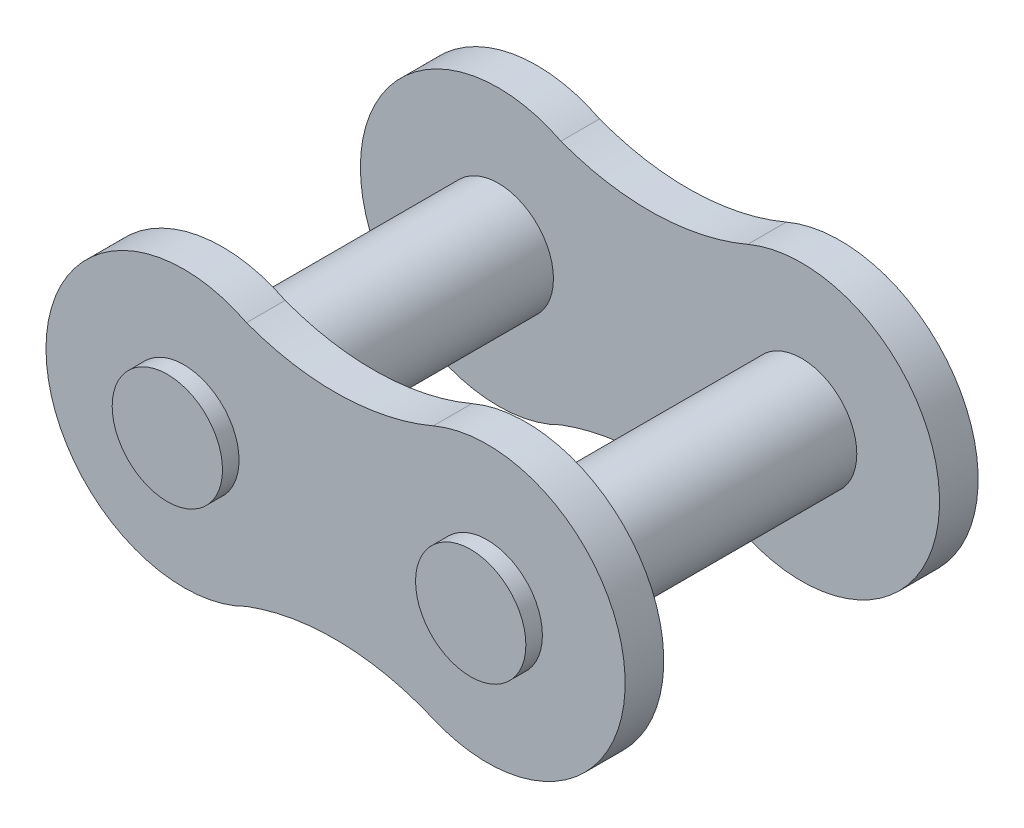
ISO-10303-21;
HEADER;
FILE_DESCRIPTION(('STEP AP214'),'2;1');
FILE_NAME('part.step','',(''),(''),'','','');
FILE_SCHEMA(('AUTOMOTIVE_DESIGN { 1 0 10303 214 1 1 1 1 }'));
ENDSEC;
DATA;
#1=APPLICATION_CONTEXT('core data for automotive mechanical design processes');
#2=APPLICATION_PROTOCOL_DEFINITION('international standard','automotive_design',2000,#1);
#3=PRODUCT_CONTEXT('',#1,'mechanical');
#4=PRODUCT('Part','Part','',(#3));
#5=PRODUCT_RELATED_PRODUCT_CATEGORY('part','',(#4));
#6=PRODUCT_DEFINITION_FORMATION('','',#4);
#7=PRODUCT_DEFINITION_CONTEXT('part definition',#1,'design');
#8=PRODUCT_DEFINITION('design','',#6,#7);
#9=PRODUCT_DEFINITION_SHAPE('','',#8);
#10=(LENGTH_UNIT() NAMED_UNIT(*) SI_UNIT(.MILLI.,.METRE.));
#11=(NAMED_UNIT(*) PLANE_ANGLE_UNIT() SI_UNIT($,.RADIAN.));
#12=(NAMED_UNIT(*) SI_UNIT($,.STERADIAN.) SOLID_ANGLE_UNIT());
#13=UNCERTAINTY_MEASURE_WITH_UNIT(LENGTH_MEASURE(1.E-05),#10,'distance_accuracy_value','');
#14=(GEOMETRIC_REPRESENTATION_CONTEXT(3) GLOBAL_UNCERTAINTY_ASSIGNED_CONTEXT((#13)) GLOBAL_UNIT_ASSIGNED_CONTEXT((#10,
#11,#12)) REPRESENTATION_CONTEXT('',''));
#15=CARTESIAN_POINT('',(0.,0.,0.));
#16=DIRECTION('',(0.,0.,1.));
#17=DIRECTION('',(1.,0.,0.));
#18=AXIS2_PLACEMENT_3D('',#15,#16,#17);
#19=CARTESIAN_POINT('',(2.75,0.,-6.));
#20=DIRECTION('',(0.,0.,1.));
#21=DIRECTION('',(1.,0.,0.));
#22=AXIS2_PLACEMENT_3D('',#19,#20,#21);
#23=CYLINDRICAL_SURFACE('',#22,1.);
#24=CARTESIAN_POINT('',(2.75,0.,0.));
#25=DIRECTION('',(0.,0.,1.));
#26=DIRECTION('',(1.,0.,0.));
#27=AXIS2_PLACEMENT_3D('',#24,#25,#26);
#28=CIRCLE('',#27,1.);
#29=CARTESIAN_POINT('',(3.75,0.,0.));
#30=VERTEX_POINT('',#29);
#31=EDGE_CURVE('E158',#30,#30,#28,.F.);
#32=ORIENTED_EDGE('',*,*,#31,.T.);
#33=EDGE_LOOP('',(#32));
#34=FACE_BOUND('',#33,.T.);
#35=CARTESIAN_POINT('',(2.75,0.,-5.));
#36=DIRECTION('',(0.,0.,-1.));
#37=DIRECTION('',(-1.,0.,0.));
#38=AXIS2_PLACEMENT_3D('',#35,#36,#37);
#39=CIRCLE('',#38,1.);
#40=CARTESIAN_POINT('',(1.75,0.,-5.));
#41=VERTEX_POINT('',#40);
#42=EDGE_CURVE('E11',#41,#41,#39,.T.);
#43=ORIENTED_EDGE('',*,*,#42,.F.);
#44=EDGE_LOOP('',(#43));
#45=FACE_BOUND('',#44,.T.);
#46=ADVANCED_FACE('F32',(#34,#45),#23,.T.);
#47=CARTESIAN_POINT('',(1.36834808013689,3.25198822837307,0.7));
#48=DIRECTION('',(0.,0.,1.));
#49=DIRECTION('',(1.,0.,0.));
#50=AXIS2_PLACEMENT_3D('',#47,#48,#49);
#51=PLANE('',#50);
#52=CARTESIAN_POINT('',(-2.75,0.,0.7));
#53=DIRECTION('',(0.,0.,1.));
#54=DIRECTION('',(1.,0.,0.));
#55=AXIS2_PLACEMENT_3D('',#52,#53,#54);
#56=CIRCLE('',#55,1.);
#57=CARTESIAN_POINT('',(-1.75,0.,0.7));
#58=VERTEX_POINT('',#57);
#59=EDGE_CURVE('E166',#58,#58,#56,.T.);
#60=ORIENTED_EDGE('',*,*,#59,.F.);
#61=EDGE_LOOP('',(#60));
#62=FACE_BOUND('',#61,.T.);
#63=CARTESIAN_POINT('',(-0.0133038397262195,6.50397645674614,0.7));
#64=DIRECTION('',(0.,0.,-1.));
#65=DIRECTION('',(1.,0.,0.));
#66=AXIS2_PLACEMENT_3D('',#63,#64,#65);
#67=CIRCLE('',#66,4.56665110646859);
#68=CARTESIAN_POINT('',(1.77241394187525,2.30094013371928,0.7));
#69=VERTEX_POINT('',#68);
#70=CARTESIAN_POINT('',(-1.61443216069154,2.22721478136445,0.7));
#71=VERTEX_POINT('',#70);
#72=EDGE_CURVE('E170',#69,#71,#67,.T.);
#73=ORIENTED_EDGE('',*,*,#72,.T.);
#74=CARTESIAN_POINT('',(-2.75,0.,0.7));
#75=DIRECTION('',(0.,0.,1.));
#76=DIRECTION('',(1.,0.,0.));
#77=AXIS2_PLACEMENT_3D('',#74,#75,#76);
#78=CIRCLE('',#77,2.5);
#79=CARTESIAN_POINT('',(-1.61443216069154,-2.22721478136445,0.7));
#80=VERTEX_POINT('',#79);
#81=EDGE_CURVE('E81',#71,#80,#78,.T.);
#82=ORIENTED_EDGE('',*,*,#81,.T.);
#83=CARTESIAN_POINT('',(-0.0133038397262195,-6.50397645674614,0.7));
#84=DIRECTION('',(0.,0.,-1.));
#85=DIRECTION('',(-1.,0.,0.));
#86=AXIS2_PLACEMENT_3D('',#83,#84,#85);
#87=CIRCLE('',#86,4.56665110646859);
#88=CARTESIAN_POINT('',(1.77241394187525,-2.30094013371928,0.7));
#89=VERTEX_POINT('',#88);
#90=EDGE_CURVE('E173',#80,#89,#87,.T.);
#91=ORIENTED_EDGE('',*,*,#90,.T.);
#92=CARTESIAN_POINT('',(2.75,0.,0.7));
#93=DIRECTION('',(0.,0.,1.));
#94=DIRECTION('',(1.,0.,0.));
#95=AXIS2_PLACEMENT_3D('',#92,#93,#94);
#96=CIRCLE('',#95,2.5);
#97=EDGE_CURVE('E49',#89,#69,#96,.T.);
#98=ORIENTED_EDGE('',*,*,#97,.T.);
#99=EDGE_LOOP('',(#73,#82,#91,#98));
#100=FACE_BOUND('',#99,.T.);
#101=CARTESIAN_POINT('',(2.75,0.,0.7));
#102=DIRECTION('',(0.,0.,1.));
#103=DIRECTION('',(1.,0.,0.));
#104=AXIS2_PLACEMENT_3D('',#101,#102,#103);
#105=CIRCLE('',#104,1.);
#106=CARTESIAN_POINT('',(3.75,0.,0.7));
#107=VERTEX_POINT('',#106);
#108=EDGE_CURVE('E163',#107,#107,#105,.T.);
#109=ORIENTED_EDGE('',*,*,#108,.F.);
#110=EDGE_LOOP('',(#109));
#111=FACE_BOUND('',#110,.T.);
#112=ADVANCED_FACE('F196',(#62,#100,#111),#51,.T.);
#113=CARTESIAN_POINT('',(1.36834808013689,3.25198822837307,0.));
#114=DIRECTION('',(0.,0.,1.));
#115=DIRECTION('',(1.,0.,0.));
#116=AXIS2_PLACEMENT_3D('',#113,#114,#115);
#117=PLANE('',#116);
#118=CARTESIAN_POINT('',(-2.75,0.,0.));
#119=DIRECTION('',(0.,0.,1.));
#120=DIRECTION('',(1.,0.,0.));
#121=AXIS2_PLACEMENT_3D('',#118,#119,#120);
#122=CIRCLE('',#121,1.);
#123=CARTESIAN_POINT('',(-1.75,0.,0.));
#124=VERTEX_POINT('',#123);
#125=EDGE_CURVE('E396',#124,#124,#122,.F.);
#126=ORIENTED_EDGE('',*,*,#125,.F.);
#127=EDGE_LOOP('',(#126));
#128=FACE_BOUND('',#127,.T.);
#129=CARTESIAN_POINT('',(-0.0133038397262195,6.50397645674614,0.));
#130=DIRECTION('',(0.,0.,-1.));
#131=DIRECTION('',(1.,0.,0.));
#132=AXIS2_PLACEMENT_3D('',#129,#130,#131);
#133=CIRCLE('',#132,4.56665110646859);
#134=CARTESIAN_POINT('',(1.77241394187525,2.30094013371928,0.));
#135=VERTEX_POINT('',#134);
#136=CARTESIAN_POINT('',(-1.61443216069154,2.22721478136445,0.));
#137=VERTEX_POINT('',#136);
#138=EDGE_CURVE('E169',#135,#137,#133,.T.);
#139=ORIENTED_EDGE('',*,*,#138,.F.);
#140=CARTESIAN_POINT('',(2.75,0.,0.));
#141=DIRECTION('',(0.,0.,1.));
#142=DIRECTION('',(1.,0.,0.));
#143=AXIS2_PLACEMENT_3D('',#140,#141,#142);
#144=CIRCLE('',#143,2.5);
#145=CARTESIAN_POINT('',(1.77241394187525,-2.30094013371928,0.));
#146=VERTEX_POINT('',#145);
#147=EDGE_CURVE('E73',#146,#135,#144,.T.);
#148=ORIENTED_EDGE('',*,*,#147,.F.);
#149=CARTESIAN_POINT('',(-0.0133038397262195,-6.50397645674614,0.));
#150=DIRECTION('',(0.,0.,-1.));
#151=DIRECTION('',(-1.,0.,0.));
#152=AXIS2_PLACEMENT_3D('',#149,#150,#151);
#153=CIRCLE('',#152,4.56665110646859);
#154=CARTESIAN_POINT('',(-1.61443216069154,-2.22721478136445,0.));
#155=VERTEX_POINT('',#154);
#156=EDGE_CURVE('E67',#155,#146,#153,.T.);
#157=ORIENTED_EDGE('',*,*,#156,.F.);
#158=CARTESIAN_POINT('',(-2.75,0.,0.));
#159=DIRECTION('',(0.,0.,1.));
#160=DIRECTION('',(1.,0.,0.));
#161=AXIS2_PLACEMENT_3D('',#158,#159,#160);
#162=CIRCLE('',#161,2.5);
#163=EDGE_CURVE('E179',#137,#155,#162,.T.);
#164=ORIENTED_EDGE('',*,*,#163,.F.);
#165=EDGE_LOOP('',(#139,#148,#157,#164));
#166=FACE_BOUND('',#165,.T.);
#167=ORIENTED_EDGE('',*,*,#31,.F.);
#168=EDGE_LOOP('',(#167));
#169=FACE_BOUND('',#168,.T.);
#170=ADVANCED_FACE('F193',(#128,#166,#169),#117,.F.);
#171=CARTESIAN_POINT('',(-0.0133038397262195,6.50397645674614,0.7));
#172=DIRECTION('',(0.,0.,-1.));
#173=DIRECTION('',(-1.,0.,0.));
#174=AXIS2_PLACEMENT_3D('',#171,#172,#173);
#175=CYLINDRICAL_SURFACE('',#174,4.56665110646859);
#176=ORIENTED_EDGE('',*,*,#138,.T.);
#177=DIRECTION('',(0.,0.,-1.));
#178=VECTOR('',#177,1.);
#179=CARTESIAN_POINT('',(-1.61443216069154,2.22721478136445,0.7));
#180=LINE('',#179,#178);
#181=EDGE_CURVE('E41',#71,#137,#180,.T.);
#182=ORIENTED_EDGE('',*,*,#181,.F.);
#183=ORIENTED_EDGE('',*,*,#72,.F.);
#184=DIRECTION('',(0.,0.,-1.));
#185=VECTOR('',#184,1.);
#186=CARTESIAN_POINT('',(1.77241394187525,2.30094013371928,0.7));
#187=LINE('',#186,#185);
#188=EDGE_CURVE('E176',#69,#135,#187,.T.);
#189=ORIENTED_EDGE('',*,*,#188,.T.);
#190=EDGE_LOOP('',(#176,#182,#183,#189));
#191=FACE_BOUND('',#190,.T.);
#192=ADVANCED_FACE('F34',(#191),#175,.F.);
#193=CARTESIAN_POINT('',(-2.75,0.,0.7));
#194=DIRECTION('',(0.,0.,-1.));
#195=DIRECTION('',(-1.,0.,0.));
#196=AXIS2_PLACEMENT_3D('',#193,#194,#195);
#197=CYLINDRICAL_SURFACE('',#196,2.5);
#198=ORIENTED_EDGE('',*,*,#163,.T.);
#199=DIRECTION('',(0.,0.,-1.));
#200=VECTOR('',#199,1.);
#201=CARTESIAN_POINT('',(-1.61443216069154,-2.22721478136445,0.7));
#202=LINE('',#201,#200);
#203=EDGE_CURVE('E186',#80,#155,#202,.T.);
#204=ORIENTED_EDGE('',*,*,#203,.F.);
#205=ORIENTED_EDGE('',*,*,#81,.F.);
#206=ORIENTED_EDGE('',*,*,#181,.T.);
#207=EDGE_LOOP('',(#198,#204,#205,#206));
#208=FACE_BOUND('',#207,.T.);
#209=ADVANCED_FACE('F188',(#208),#197,.T.);
#210=CARTESIAN_POINT('',(-0.0133038397262195,-6.50397645674614,0.7));
#211=DIRECTION('',(0.,0.,-1.));
#212=DIRECTION('',(-1.,0.,0.));
#213=AXIS2_PLACEMENT_3D('',#210,#211,#212);
#214=CYLINDRICAL_SURFACE('',#213,4.56665110646859);
#215=ORIENTED_EDGE('',*,*,#156,.T.);
#216=DIRECTION('',(0.,0.,-1.));
#217=VECTOR('',#216,1.);
#218=CARTESIAN_POINT('',(1.77241394187525,-2.30094013371928,0.7));
#219=LINE('',#218,#217);
#220=EDGE_CURVE('E184',#89,#146,#219,.T.);
#221=ORIENTED_EDGE('',*,*,#220,.F.);
#222=ORIENTED_EDGE('',*,*,#90,.F.);
#223=ORIENTED_EDGE('',*,*,#203,.T.);
#224=EDGE_LOOP('',(#215,#221,#222,#223));
#225=FACE_BOUND('',#224,.T.);
#226=ADVANCED_FACE('F249',(#225),#214,.F.);
#227=CARTESIAN_POINT('',(2.75,0.,0.7));
#228=DIRECTION('',(0.,0.,-1.));
#229=DIRECTION('',(-1.,0.,0.));
#230=AXIS2_PLACEMENT_3D('',#227,#228,#229);
#231=CYLINDRICAL_SURFACE('',#230,2.5);
#232=ORIENTED_EDGE('',*,*,#147,.T.);
#233=ORIENTED_EDGE('',*,*,#188,.F.);
#234=ORIENTED_EDGE('',*,*,#97,.F.);
#235=ORIENTED_EDGE('',*,*,#220,.T.);
#236=EDGE_LOOP('',(#232,#233,#234,#235));
#237=FACE_BOUND('',#236,.T.);
#238=ADVANCED_FACE('F242',(#237),#231,.T.);
#239=ORIENTED_EDGE('',*,*,#108,.T.);
#240=EDGE_LOOP('',(#239));
#241=FACE_BOUND('',#240,.T.);
#242=CARTESIAN_POINT('',(2.75,0.,1.));
#243=DIRECTION('',(0.,0.,-1.));
#244=DIRECTION('',(-1.,0.,0.));
#245=AXIS2_PLACEMENT_3D('',#242,#243,#244);
#246=CIRCLE('',#245,1.);
#247=CARTESIAN_POINT('',(1.75,0.,1.));
#248=VERTEX_POINT('',#247);
#249=EDGE_CURVE('E119',#248,#248,#246,.T.);
#250=ORIENTED_EDGE('',*,*,#249,.T.);
#251=EDGE_LOOP('',(#250));
#252=FACE_BOUND('',#251,.T.);
#253=ADVANCED_FACE('F205',(#241,#252),#23,.T.);
#254=CARTESIAN_POINT('',(2.75,0.,1.));
#255=DIRECTION('',(0.,0.,-1.));
#256=DIRECTION('',(-1.,0.,0.));
#257=AXIS2_PLACEMENT_3D('',#254,#255,#256);
#258=PLANE('',#257);
#259=ORIENTED_EDGE('',*,*,#249,.F.);
#260=EDGE_LOOP('',(#259));
#261=FACE_BOUND('',#260,.T.);
#262=ADVANCED_FACE('F217',(#261),#258,.F.);
#263=CARTESIAN_POINT('',(1.36834808013689,3.25198822837307,-5.7));
#264=DIRECTION('',(0.,0.,-1.));
#265=DIRECTION('',(1.,0.,0.));
#266=AXIS2_PLACEMENT_3D('',#263,#264,#265);
#267=PLANE('',#266);
#268=CARTESIAN_POINT('',(-2.75,0.,-5.7));
#269=DIRECTION('',(0.,0.,-1.));
#270=DIRECTION('',(-1.,0.,0.));
#271=AXIS2_PLACEMENT_3D('',#268,#269,#270);
#272=CIRCLE('',#271,1.);
#273=CARTESIAN_POINT('',(-3.75,0.,-5.7));
#274=VERTEX_POINT('',#273);
#275=EDGE_CURVE('E391',#274,#274,#272,.F.);
#276=ORIENTED_EDGE('',*,*,#275,.T.);
#277=EDGE_LOOP('',(#276));
#278=FACE_BOUND('',#277,.T.);
#279=CARTESIAN_POINT('',(-0.0133038397262195,6.50397645674614,-5.7));
#280=DIRECTION('',(0.,0.,-1.));
#281=DIRECTION('',(1.,0.,0.));
#282=AXIS2_PLACEMENT_3D('',#279,#280,#281);
#283=CIRCLE('',#282,4.56665110646859);
#284=CARTESIAN_POINT('',(1.77241394187525,2.30094013371928,-5.7));
#285=VERTEX_POINT('',#284);
#286=CARTESIAN_POINT('',(-1.61443216069154,2.22721478136445,-5.7));
#287=VERTEX_POINT('',#286);
#288=EDGE_CURVE('E127',#285,#287,#283,.T.);
#289=ORIENTED_EDGE('',*,*,#288,.F.);
#290=CARTESIAN_POINT('',(2.75,0.,-5.7));
#291=DIRECTION('',(0.,0.,1.));
#292=DIRECTION('',(1.,0.,0.));
#293=AXIS2_PLACEMENT_3D('',#290,#291,#292);
#294=CIRCLE('',#293,2.5);
#295=CARTESIAN_POINT('',(1.77241394187525,-2.30094013371928,-5.7));
#296=VERTEX_POINT('',#295);
#297=EDGE_CURVE('E144',#296,#285,#294,.T.);
#298=ORIENTED_EDGE('',*,*,#297,.F.);
#299=CARTESIAN_POINT('',(-0.0133038397262195,-6.50397645674614,-5.7));
#300=DIRECTION('',(0.,0.,-1.));
#301=DIRECTION('',(-1.,0.,0.));
#302=AXIS2_PLACEMENT_3D('',#299,#300,#301);
#303=CIRCLE('',#302,4.56665110646859);
#304=CARTESIAN_POINT('',(-1.61443216069154,-2.22721478136445,-5.7));
#305=VERTEX_POINT('',#304);
#306=EDGE_CURVE('E129',#305,#296,#303,.T.);
#307=ORIENTED_EDGE('',*,*,#306,.F.);
#308=CARTESIAN_POINT('',(-2.75,0.,-5.7));
#309=DIRECTION('',(0.,0.,1.));
#310=DIRECTION('',(1.,0.,0.));
#311=AXIS2_PLACEMENT_3D('',#308,#309,#310);
#312=CIRCLE('',#311,2.5);
#313=EDGE_CURVE('E111',#287,#305,#312,.T.);
#314=ORIENTED_EDGE('',*,*,#313,.F.);
#315=EDGE_LOOP('',(#289,#298,#307,#314));
#316=FACE_BOUND('',#315,.T.);
#317=CARTESIAN_POINT('',(2.75,0.,-5.7));
#318=DIRECTION('',(0.,0.,1.));
#319=DIRECTION('',(1.,0.,0.));
#320=AXIS2_PLACEMENT_3D('',#317,#318,#319);
#321=CIRCLE('',#320,1.);
#322=CARTESIAN_POINT('',(3.75,0.,-5.7));
#323=VERTEX_POINT('',#322);
#324=EDGE_CURVE('E398',#323,#323,#321,.T.);
#325=ORIENTED_EDGE('',*,*,#324,.T.);
#326=EDGE_LOOP('',(#325));
#327=FACE_BOUND('',#326,.T.);
#328=ADVANCED_FACE('F124',(#278,#316,#327),#267,.T.);
#329=CARTESIAN_POINT('',(1.36834808013689,3.25198822837307,-5.));
#330=DIRECTION('',(0.,0.,-1.));
#331=DIRECTION('',(1.,0.,0.));
#332=AXIS2_PLACEMENT_3D('',#329,#330,#331);
#333=PLANE('',#332);
#334=CARTESIAN_POINT('',(-2.75,0.,-5.));
#335=DIRECTION('',(0.,0.,1.));
#336=DIRECTION('',(1.,0.,0.));
#337=AXIS2_PLACEMENT_3D('',#334,#335,#336);
#338=CIRCLE('',#337,1.);
#339=CARTESIAN_POINT('',(-1.75,0.,-5.));
#340=VERTEX_POINT('',#339);
#341=EDGE_CURVE('E140',#340,#340,#338,.T.);
#342=ORIENTED_EDGE('',*,*,#341,.F.);
#343=EDGE_LOOP('',(#342));
#344=FACE_BOUND('',#343,.T.);
#345=CARTESIAN_POINT('',(-0.0133038397262195,6.50397645674614,-5.));
#346=DIRECTION('',(0.,0.,-1.));
#347=DIRECTION('',(1.,0.,0.));
#348=AXIS2_PLACEMENT_3D('',#345,#346,#347);
#349=CIRCLE('',#348,4.56665110646859);
#350=CARTESIAN_POINT('',(1.77241394187525,2.30094013371928,-5.));
#351=VERTEX_POINT('',#350);
#352=CARTESIAN_POINT('',(-1.61443216069154,2.22721478136445,-5.));
#353=VERTEX_POINT('',#352);
#354=EDGE_CURVE('E146',#351,#353,#349,.T.);
#355=ORIENTED_EDGE('',*,*,#354,.T.);
#356=CARTESIAN_POINT('',(-2.75,0.,-5.));
#357=DIRECTION('',(0.,0.,1.));
#358=DIRECTION('',(1.,0.,0.));
#359=AXIS2_PLACEMENT_3D('',#356,#357,#358);
#360=CIRCLE('',#359,2.5);
#361=CARTESIAN_POINT('',(-1.61443216069154,-2.22721478136445,-5.));
#362=VERTEX_POINT('',#361);
#363=EDGE_CURVE('E114',#353,#362,#360,.T.);
#364=ORIENTED_EDGE('',*,*,#363,.T.);
#365=CARTESIAN_POINT('',(-0.0133038397262195,-6.50397645674614,-5.));
#366=DIRECTION('',(0.,0.,-1.));
#367=DIRECTION('',(-1.,0.,0.));
#368=AXIS2_PLACEMENT_3D('',#365,#366,#367);
#369=CIRCLE('',#368,4.56665110646859);
#370=CARTESIAN_POINT('',(1.77241394187525,-2.30094013371928,-5.));
#371=VERTEX_POINT('',#370);
#372=EDGE_CURVE('E137',#362,#371,#369,.T.);
#373=ORIENTED_EDGE('',*,*,#372,.T.);
#374=CARTESIAN_POINT('',(2.75,0.,-5.));
#375=DIRECTION('',(0.,0.,1.));
#376=DIRECTION('',(1.,0.,0.));
#377=AXIS2_PLACEMENT_3D('',#374,#375,#376);
#378=CIRCLE('',#377,2.5);
#379=EDGE_CURVE('E134',#371,#351,#378,.T.);
#380=ORIENTED_EDGE('',*,*,#379,.T.);
#381=EDGE_LOOP('',(#355,#364,#373,#380));
#382=FACE_BOUND('',#381,.T.);
#383=ORIENTED_EDGE('',*,*,#42,.T.);
#384=EDGE_LOOP('',(#383));
#385=FACE_BOUND('',#384,.T.);
#386=ADVANCED_FACE('F208',(#344,#382,#385),#333,.F.);
#387=CARTESIAN_POINT('',(-0.0133038397262195,6.50397645674614,-5.7));
#388=DIRECTION('',(0.,0.,1.));
#389=DIRECTION('',(-1.,0.,0.));
#390=AXIS2_PLACEMENT_3D('',#387,#388,#389);
#391=CYLINDRICAL_SURFACE('',#390,4.56665110646859);
#392=ORIENTED_EDGE('',*,*,#354,.F.);
#393=DIRECTION('',(0.,0.,1.));
#394=VECTOR('',#393,1.);
#395=CARTESIAN_POINT('',(1.77241394187525,2.30094013371928,-5.7));
#396=LINE('',#395,#394);
#397=EDGE_CURVE('E132',#285,#351,#396,.T.);
#398=ORIENTED_EDGE('',*,*,#397,.F.);
#399=ORIENTED_EDGE('',*,*,#288,.T.);
#400=DIRECTION('',(0.,0.,1.));
#401=VECTOR('',#400,1.);
#402=CARTESIAN_POINT('',(-1.61443216069154,2.22721478136445,-5.7));
#403=LINE('',#402,#401);
#404=EDGE_CURVE('E108',#287,#353,#403,.T.);
#405=ORIENTED_EDGE('',*,*,#404,.T.);
#406=EDGE_LOOP('',(#392,#398,#399,#405));
#407=FACE_BOUND('',#406,.T.);
#408=ADVANCED_FACE('F131',(#407),#391,.F.);
#409=CARTESIAN_POINT('',(-2.75,0.,-5.7));
#410=DIRECTION('',(0.,0.,1.));
#411=DIRECTION('',(-1.,0.,0.));
#412=AXIS2_PLACEMENT_3D('',#409,#410,#411);
#413=CYLINDRICAL_SURFACE('',#412,2.5);
#414=ORIENTED_EDGE('',*,*,#363,.F.);
#415=ORIENTED_EDGE('',*,*,#404,.F.);
#416=ORIENTED_EDGE('',*,*,#313,.T.);
#417=DIRECTION('',(0.,0.,1.));
#418=VECTOR('',#417,1.);
#419=CARTESIAN_POINT('',(-1.61443216069154,-2.22721478136445,-5.7));
#420=LINE('',#419,#418);
#421=EDGE_CURVE('E120',#305,#362,#420,.T.);
#422=ORIENTED_EDGE('',*,*,#421,.T.);
#423=EDGE_LOOP('',(#414,#415,#416,#422));
#424=FACE_BOUND('',#423,.T.);
#425=ADVANCED_FACE('F110',(#424),#413,.T.);
#426=CARTESIAN_POINT('',(-0.0133038397262195,-6.50397645674614,-5.7));
#427=DIRECTION('',(0.,0.,1.));
#428=DIRECTION('',(-1.,0.,0.));
#429=AXIS2_PLACEMENT_3D('',#426,#427,#428);
#430=CYLINDRICAL_SURFACE('',#429,4.56665110646859);
#431=ORIENTED_EDGE('',*,*,#372,.F.);
#432=ORIENTED_EDGE('',*,*,#421,.F.);
#433=ORIENTED_EDGE('',*,*,#306,.T.);
#434=DIRECTION('',(0.,0.,1.));
#435=VECTOR('',#434,1.);
#436=CARTESIAN_POINT('',(1.77241394187525,-2.30094013371928,-5.7));
#437=LINE('',#436,#435);
#438=EDGE_CURVE('E152',#296,#371,#437,.T.);
#439=ORIENTED_EDGE('',*,*,#438,.T.);
#440=EDGE_LOOP('',(#431,#432,#433,#439));
#441=FACE_BOUND('',#440,.T.);
#442=ADVANCED_FACE('F228',(#441),#430,.F.);
#443=CARTESIAN_POINT('',(2.75,0.,-5.7));
#444=DIRECTION('',(0.,0.,1.));
#445=DIRECTION('',(-1.,0.,0.));
#446=AXIS2_PLACEMENT_3D('',#443,#444,#445);
#447=CYLINDRICAL_SURFACE('',#446,2.5);
#448=ORIENTED_EDGE('',*,*,#379,.F.);
#449=ORIENTED_EDGE('',*,*,#438,.F.);
#450=ORIENTED_EDGE('',*,*,#297,.T.);
#451=ORIENTED_EDGE('',*,*,#397,.T.);
#452=EDGE_LOOP('',(#448,#449,#450,#451));
#453=FACE_BOUND('',#452,.T.);
#454=ADVANCED_FACE('F224',(#453),#447,.T.);
#455=CARTESIAN_POINT('',(2.75,0.,-6.));
#456=DIRECTION('',(0.,0.,-1.));
#457=DIRECTION('',(-1.,0.,0.));
#458=AXIS2_PLACEMENT_3D('',#455,#456,#457);
#459=PLANE('',#458);
#460=CARTESIAN_POINT('',(2.75,0.,-6.));
#461=DIRECTION('',(0.,0.,-1.));
#462=DIRECTION('',(-1.,0.,0.));
#463=AXIS2_PLACEMENT_3D('',#460,#461,#462);
#464=CIRCLE('',#463,1.);
#465=CARTESIAN_POINT('',(1.75,0.,-6.));
#466=VERTEX_POINT('',#465);
#467=EDGE_CURVE('E155',#466,#466,#464,.T.);
#468=ORIENTED_EDGE('',*,*,#467,.T.);
#469=EDGE_LOOP('',(#468));
#470=FACE_BOUND('',#469,.T.);
#471=ADVANCED_FACE('F227',(#470),#459,.T.);
#472=ORIENTED_EDGE('',*,*,#324,.F.);
#473=EDGE_LOOP('',(#472));
#474=FACE_BOUND('',#473,.T.);
#475=ORIENTED_EDGE('',*,*,#467,.F.);
#476=EDGE_LOOP('',(#475));
#477=FACE_BOUND('',#476,.T.);
#478=ADVANCED_FACE('F204',(#474,#477),#23,.T.);
#479=CARTESIAN_POINT('',(-2.75,0.,-6.));
#480=DIRECTION('',(0.,0.,1.));
#481=DIRECTION('',(1.,0.,0.));
#482=AXIS2_PLACEMENT_3D('',#479,#480,#481);
#483=CYLINDRICAL_SURFACE('',#482,1.);
#484=ORIENTED_EDGE('',*,*,#341,.T.);
#485=EDGE_LOOP('',(#484));
#486=FACE_BOUND('',#485,.T.);
#487=ORIENTED_EDGE('',*,*,#125,.T.);
#488=EDGE_LOOP('',(#487));
#489=FACE_BOUND('',#488,.T.);
#490=ADVANCED_FACE('F334',(#486,#489),#483,.T.);
#491=CARTESIAN_POINT('',(-2.75,0.,-6.));
#492=DIRECTION('',(0.,0.,-1.));
#493=DIRECTION('',(-1.,0.,0.));
#494=AXIS2_PLACEMENT_3D('',#491,#492,#493);
#495=PLANE('',#494);
#496=CARTESIAN_POINT('',(-2.75,0.,-6.));
#497=DIRECTION('',(0.,0.,-1.));
#498=DIRECTION('',(-1.,0.,0.));
#499=AXIS2_PLACEMENT_3D('',#496,#497,#498);
#500=CIRCLE('',#499,1.);
#501=CARTESIAN_POINT('',(-3.75,0.,-6.));
#502=VERTEX_POINT('',#501);
#503=EDGE_CURVE('E388',#502,#502,#500,.T.);
#504=ORIENTED_EDGE('',*,*,#503,.T.);
#505=EDGE_LOOP('',(#504));
#506=FACE_BOUND('',#505,.T.);
#507=ADVANCED_FACE('F343',(#506),#495,.T.);
#508=ORIENTED_EDGE('',*,*,#275,.F.);
#509=EDGE_LOOP('',(#508));
#510=FACE_BOUND('',#509,.T.);
#511=ORIENTED_EDGE('',*,*,#503,.F.);
#512=EDGE_LOOP('',(#511));
#513=FACE_BOUND('',#512,.T.);
#514=ADVANCED_FACE('F346',(#510,#513),#483,.T.);
#515=ORIENTED_EDGE('',*,*,#59,.T.);
#516=EDGE_LOOP('',(#515));
#517=FACE_BOUND('',#516,.T.);
#518=CARTESIAN_POINT('',(-2.75,0.,1.));
#519=DIRECTION('',(0.,0.,-1.));
#520=DIRECTION('',(-1.,0.,0.));
#521=AXIS2_PLACEMENT_3D('',#518,#519,#520);
#522=CIRCLE('',#521,1.);
#523=CARTESIAN_POINT('',(-3.75,0.,1.));
#524=VERTEX_POINT('',#523);
#525=EDGE_CURVE('E386',#524,#524,#522,.T.);
#526=ORIENTED_EDGE('',*,*,#525,.T.);
#527=EDGE_LOOP('',(#526));
#528=FACE_BOUND('',#527,.T.);
#529=ADVANCED_FACE('F345',(#517,#528),#483,.T.);
#530=CARTESIAN_POINT('',(-2.75,0.,1.));
#531=DIRECTION('',(0.,0.,-1.));
#532=DIRECTION('',(-1.,0.,0.));
#533=AXIS2_PLACEMENT_3D('',#530,#531,#532);
#534=PLANE('',#533);
#535=ORIENTED_EDGE('',*,*,#525,.F.);
#536=EDGE_LOOP('',(#535));
#537=FACE_BOUND('',#536,.T.);
#538=ADVANCED_FACE('F371',(#537),#534,.F.);
#539=CLOSED_SHELL('',(#46,#112,#170,#192,#209,#226,#238,#253,#262,#328,#386,#408,#425,#442,#454,
#471,#478,#490,#507,#514,#529,#538));
#540=MANIFOLD_SOLID_BREP('B2',#539);
#541=ADVANCED_BREP_SHAPE_REPRESENTATION('',(#18,#540),#14);
#542=SHAPE_DEFINITION_REPRESENTATION(#9,#541);
ENDSEC;
END-ISO-10303-21;
